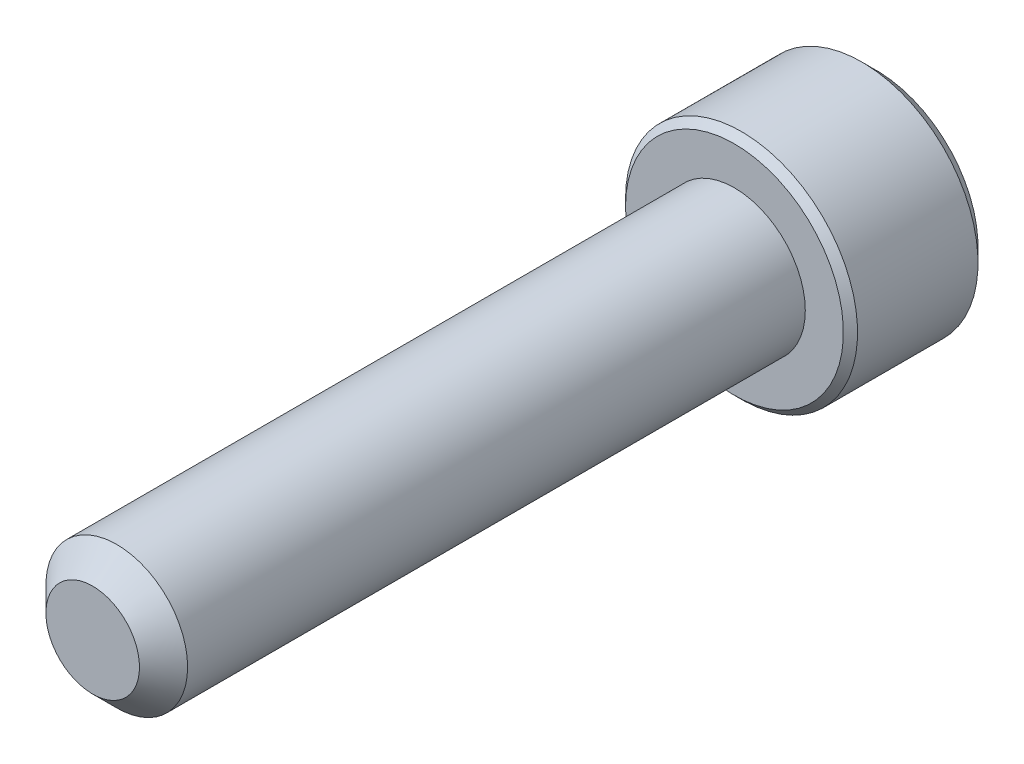
ISO-10303-21;
HEADER;
FILE_DESCRIPTION(('STEP AP214'),'2;1');
FILE_NAME('part.step','',(''),(''),'','','');
FILE_SCHEMA(('AUTOMOTIVE_DESIGN { 1 0 10303 214 1 1 1 1 }'));
ENDSEC;
DATA;
#1=APPLICATION_CONTEXT('core data for automotive mechanical design processes');
#2=APPLICATION_PROTOCOL_DEFINITION('international standard','automotive_design',2000,#1);
#3=PRODUCT_CONTEXT('',#1,'mechanical');
#4=PRODUCT('Part','Part','',(#3));
#5=PRODUCT_RELATED_PRODUCT_CATEGORY('part','',(#4));
#6=PRODUCT_DEFINITION_FORMATION('','',#4);
#7=PRODUCT_DEFINITION_CONTEXT('part definition',#1,'design');
#8=PRODUCT_DEFINITION('design','',#6,#7);
#9=PRODUCT_DEFINITION_SHAPE('','',#8);
#10=(LENGTH_UNIT() NAMED_UNIT(*) SI_UNIT(.MILLI.,.METRE.));
#11=(NAMED_UNIT(*) PLANE_ANGLE_UNIT() SI_UNIT($,.RADIAN.));
#12=(NAMED_UNIT(*) SI_UNIT($,.STERADIAN.) SOLID_ANGLE_UNIT());
#13=UNCERTAINTY_MEASURE_WITH_UNIT(LENGTH_MEASURE(1.E-05),#10,'distance_accuracy_value','');
#14=(GEOMETRIC_REPRESENTATION_CONTEXT(3) GLOBAL_UNCERTAINTY_ASSIGNED_CONTEXT((#13)) GLOBAL_UNIT_ASSIGNED_CONTEXT((#10,
#11,#12)) REPRESENTATION_CONTEXT('',''));
#15=CARTESIAN_POINT('',(0.,0.,0.));
#16=DIRECTION('',(0.,0.,1.));
#17=DIRECTION('',(1.,0.,0.));
#18=AXIS2_PLACEMENT_3D('',#15,#16,#17);
#19=CARTESIAN_POINT('',(0.,0.,-15.875));
#20=DIRECTION('',(0.,0.,1.));
#21=DIRECTION('',(1.,0.,0.));
#22=AXIS2_PLACEMENT_3D('',#19,#20,#21);
#23=CYLINDRICAL_SURFACE('',#22,1.7526);
#24=CARTESIAN_POINT('',(0.,0.,-0.5953125));
#25=DIRECTION('',(0.,0.,1.));
#26=DIRECTION('',(1.,0.,0.));
#27=AXIS2_PLACEMENT_3D('',#24,#25,#26);
#28=CIRCLE('',#27,1.7526);
#29=CARTESIAN_POINT('',(1.7526,0.,-0.5953125));
#30=VERTEX_POINT('',#29);
#31=EDGE_CURVE('E111',#30,#30,#28,.F.);
#32=ORIENTED_EDGE('',*,*,#31,.T.);
#33=EDGE_LOOP('',(#32));
#34=FACE_BOUND('',#33,.T.);
#35=CARTESIAN_POINT('',(0.,0.,-15.875));
#36=DIRECTION('',(0.,0.,-1.));
#37=DIRECTION('',(-1.,0.,0.));
#38=AXIS2_PLACEMENT_3D('',#35,#36,#37);
#39=CIRCLE('',#38,1.7526);
#40=CARTESIAN_POINT('',(-1.7526,0.,-15.875));
#41=VERTEX_POINT('',#40);
#42=EDGE_CURVE('E211',#41,#41,#39,.F.);
#43=ORIENTED_EDGE('',*,*,#42,.T.);
#44=EDGE_LOOP('',(#43));
#45=FACE_BOUND('',#44,.T.);
#46=ADVANCED_FACE('F37',(#34,#45),#23,.T.);
#47=CARTESIAN_POINT('',(0.,0.,0.));
#48=DIRECTION('',(0.,0.,1.));
#49=DIRECTION('',(1.,0.,0.));
#50=AXIS2_PLACEMENT_3D('',#47,#48,#49);
#51=PLANE('',#50);
#52=CARTESIAN_POINT('',(0.,0.,0.));
#53=DIRECTION('',(0.,0.,1.));
#54=DIRECTION('',(1.,0.,0.));
#55=AXIS2_PLACEMENT_3D('',#52,#53,#54);
#56=CIRCLE('',#55,1.1572875);
#57=CARTESIAN_POINT('',(1.1572875,0.,0.));
#58=VERTEX_POINT('',#57);
#59=EDGE_CURVE('E210',#58,#58,#56,.T.);
#60=ORIENTED_EDGE('',*,*,#59,.T.);
#61=EDGE_LOOP('',(#60));
#62=FACE_BOUND('',#61,.T.);
#63=ADVANCED_FACE('F188',(#62),#51,.T.);
#64=CARTESIAN_POINT('',(0.,0.,0.));
#65=DIRECTION('',(0.,0.,-1.));
#66=DIRECTION('',(-1.,0.,0.));
#67=AXIS2_PLACEMENT_3D('',#64,#65,#66);
#68=CONICAL_SURFACE('',#67,1.1572875,0.785398163397445);
#69=ORIENTED_EDGE('',*,*,#31,.F.);
#70=EDGE_LOOP('',(#69));
#71=FACE_BOUND('',#70,.T.);
#72=ORIENTED_EDGE('',*,*,#59,.F.);
#73=EDGE_LOOP('',(#72));
#74=FACE_BOUND('',#73,.T.);
#75=ADVANCED_FACE('F194',(#71,#74),#68,.T.);
#76=CARTESIAN_POINT('',(0.,0.,-19.3802));
#77=DIRECTION('',(0.,0.,1.));
#78=DIRECTION('',(1.,0.,0.));
#79=AXIS2_PLACEMENT_3D('',#76,#77,#78);
#80=CYLINDRICAL_SURFACE('',#79,2.8702);
#81=CARTESIAN_POINT('',(0.,0.,-16.05026));
#82=DIRECTION('',(0.,0.,-1.));
#83=DIRECTION('',(-1.,0.,0.));
#84=AXIS2_PLACEMENT_3D('',#81,#82,#83);
#85=CIRCLE('',#84,2.8702);
#86=CARTESIAN_POINT('',(-2.8702,0.,-16.05026));
#87=VERTEX_POINT('',#86);
#88=EDGE_CURVE('E45',#87,#87,#85,.T.);
#89=ORIENTED_EDGE('',*,*,#88,.T.);
#90=EDGE_LOOP('',(#89));
#91=FACE_BOUND('',#90,.T.);
#92=CARTESIAN_POINT('',(0.,0.,-19.02968));
#93=DIRECTION('',(0.,0.,-1.));
#94=DIRECTION('',(-1.,0.,0.));
#95=AXIS2_PLACEMENT_3D('',#92,#93,#94);
#96=CIRCLE('',#95,2.8702);
#97=CARTESIAN_POINT('',(-2.8702,0.,-19.02968));
#98=VERTEX_POINT('',#97);
#99=EDGE_CURVE('E171',#98,#98,#96,.F.);
#100=ORIENTED_EDGE('',*,*,#99,.T.);
#101=EDGE_LOOP('',(#100));
#102=FACE_BOUND('',#101,.T.);
#103=ADVANCED_FACE('F176',(#91,#102),#80,.T.);
#104=CARTESIAN_POINT('',(0.,0.,-19.3802));
#105=DIRECTION('',(0.,0.,-1.));
#106=DIRECTION('',(-1.,0.,0.));
#107=AXIS2_PLACEMENT_3D('',#104,#105,#106);
#108=PLANE('',#107);
#109=CARTESIAN_POINT('',(0.,0.,-19.3802));
#110=DIRECTION('',(0.,0.,-1.));
#111=DIRECTION('',(-1.,0.,0.));
#112=AXIS2_PLACEMENT_3D('',#109,#110,#111);
#113=CIRCLE('',#112,2.51968);
#114=CARTESIAN_POINT('',(-2.51968,0.,-19.3802));
#115=VERTEX_POINT('',#114);
#116=EDGE_CURVE('E110',#115,#115,#113,.T.);
#117=ORIENTED_EDGE('',*,*,#116,.T.);
#118=EDGE_LOOP('',(#117));
#119=FACE_BOUND('',#118,.T.);
#120=CARTESIAN_POINT('',(0.,0.,-19.3802));
#121=DIRECTION('',(0.,0.,-1.));
#122=DIRECTION('',(-1.,0.,0.));
#123=AXIS2_PLACEMENT_3D('',#120,#121,#122);
#124=CIRCLE('',#123,1.60395121659243);
#125=CARTESIAN_POINT('',(-1.3890625,0.801975608296217,-19.3802));
#126=VERTEX_POINT('',#125);
#127=CARTESIAN_POINT('',(0.,1.60395121659243,-19.3802));
#128=VERTEX_POINT('',#127);
#129=EDGE_CURVE('E91',#126,#128,#124,.T.);
#130=ORIENTED_EDGE('',*,*,#129,.F.);
#131=CARTESIAN_POINT('',(-1.3890625,-0.801975608296215,-19.3802));
#132=VERTEX_POINT('',#131);
#133=EDGE_CURVE('E51',#132,#126,#124,.T.);
#134=ORIENTED_EDGE('',*,*,#133,.F.);
#135=CARTESIAN_POINT('',(0.,-1.60395121659243,-19.3802));
#136=VERTEX_POINT('',#135);
#137=EDGE_CURVE('E267',#136,#132,#124,.T.);
#138=ORIENTED_EDGE('',*,*,#137,.F.);
#139=CARTESIAN_POINT('',(1.3890625,-0.801975608296215,-19.3802));
#140=VERTEX_POINT('',#139);
#141=EDGE_CURVE('E58',#140,#136,#124,.T.);
#142=ORIENTED_EDGE('',*,*,#141,.F.);
#143=CARTESIAN_POINT('',(1.3890625,0.801975608296215,-19.3802));
#144=VERTEX_POINT('',#143);
#145=EDGE_CURVE('E132',#144,#140,#124,.T.);
#146=ORIENTED_EDGE('',*,*,#145,.F.);
#147=EDGE_CURVE('E100',#128,#144,#124,.T.);
#148=ORIENTED_EDGE('',*,*,#147,.F.);
#149=EDGE_LOOP('',(#130,#134,#138,#142,#146,#148));
#150=FACE_BOUND('',#149,.T.);
#151=ADVANCED_FACE('F131',(#119,#150),#108,.T.);
#152=CARTESIAN_POINT('',(0.,0.,-15.875));
#153=DIRECTION('',(0.,0.,-1.));
#154=DIRECTION('',(-1.,0.,0.));
#155=AXIS2_PLACEMENT_3D('',#152,#153,#154);
#156=PLANE('',#155);
#157=CARTESIAN_POINT('',(0.,0.,-15.875));
#158=DIRECTION('',(0.,0.,-1.));
#159=DIRECTION('',(-1.,0.,0.));
#160=AXIS2_PLACEMENT_3D('',#157,#158,#159);
#161=CIRCLE('',#160,2.69494);
#162=CARTESIAN_POINT('',(-2.69494,0.,-15.875));
#163=VERTEX_POINT('',#162);
#164=EDGE_CURVE('E12',#163,#163,#161,.F.);
#165=ORIENTED_EDGE('',*,*,#164,.T.);
#166=EDGE_LOOP('',(#165));
#167=FACE_BOUND('',#166,.T.);
#168=ORIENTED_EDGE('',*,*,#42,.F.);
#169=EDGE_LOOP('',(#168));
#170=FACE_BOUND('',#169,.T.);
#171=ADVANCED_FACE('F279',(#167,#170),#156,.F.);
#172=CARTESIAN_POINT('',(0.,0.,-19.3802));
#173=DIRECTION('',(0.,0.,-1.));
#174=DIRECTION('',(-1.,0.,0.));
#175=AXIS2_PLACEMENT_3D('',#172,#173,#174);
#176=CONICAL_SURFACE('',#175,1.60395121659243,0.78539816339745);
#177=ORIENTED_EDGE('',*,*,#147,.T.);
#178=CARTESIAN_POINT('',(-0.000200000000000534,1.60406668664627,-19.3803154825221));
#179=CARTESIAN_POINT('',(0.047554814899585,1.57649543140889,-19.352764786881));
#180=CARTESIAN_POINT('',(0.0961082129767664,1.54846311395896,-19.3268319141145));
#181=CARTESIAN_POINT('',(0.195114281423183,1.49130193369001,-19.2793489608708));
#182=CARTESIAN_POINT('',(0.245576372730139,1.46216763169007,-19.2578253080794));
#183=CARTESIAN_POINT('',(0.347330835284907,1.40341966534283,-19.2209546019866));
#184=CARTESIAN_POINT('',(0.398597278416373,1.37382097060048,-19.2055148513149));
#185=CARTESIAN_POINT('',(0.502259069123936,1.31397180783079,-19.1817264581829));
#186=CARTESIAN_POINT('',(0.554651247789431,1.28372316937484,-19.1733600517165));
#187=CARTESIAN_POINT('',(0.644944084544834,1.23159257576821,-19.1658113663708));
#188=CARTESIAN_POINT('',(0.6827280342556,1.20977800223165,-19.1646936971037));
#189=CARTESIAN_POINT('',(0.758229287800437,1.16618733317339,-19.1665750513552));
#190=CARTESIAN_POINT('',(0.795946575086517,1.14441124720567,-19.1695749834252));
#191=CARTESIAN_POINT('',(0.87101801890652,1.10106872890774,-19.1795189567457));
#192=CARTESIAN_POINT('',(0.908371804329553,1.0795025108385,-19.1864666704902));
#193=CARTESIAN_POINT('',(0.982452435596039,1.03673203843505,-19.2039288810594));
#194=CARTESIAN_POINT('',(1.01917900521513,1.01552794357906,-19.2144449088769));
#195=CARTESIAN_POINT('',(1.11325413716703,0.961213640822578,-19.2456664203823));
#196=CARTESIAN_POINT('',(1.17001916310317,0.928440337817795,-19.2687263608604));
#197=CARTESIAN_POINT('',(1.25348479270274,0.880251434100403,-19.3076547118294));
#198=CARTESIAN_POINT('',(1.28098915116073,0.86437178534079,-19.3213318145832));
#199=CARTESIAN_POINT('',(1.33549195495674,0.832904576897577,-19.3499348081189));
#200=CARTESIAN_POINT('',(1.36249063449213,0.817316882000056,-19.3648601023926));
#201=CARTESIAN_POINT('',(1.3892625,0.801860138242377,-19.3803154825221));
#202=B_SPLINE_CURVE_WITH_KNOTS('',3,(#178,#179,#180,#181,#182,#183,#184,#185,#186,#187,#188,
#189,#190,#191,#192,#193,#194,#195,#196,#197,#198,#199,#200,#201),.UNSPECIFIED.,.F.,.F.,(4,2,2,
2,2,2,2,2,2,2,2,4),(0.,0.185054161583331,0.371186974731964,0.554362620151552,0.737076859824673,
0.867821902366107,0.998595798526817,1.12949154907136,1.26044353188444,1.46846066168042,
1.57218026599104,1.67585058309997),.UNSPECIFIED.);
#203=EDGE_CURVE('E105',#128,#144,#202,.T.);
#204=ORIENTED_EDGE('',*,*,#203,.F.);
#205=EDGE_LOOP('',(#177,#204));
#206=FACE_BOUND('',#205,.T.);
#207=ADVANCED_FACE('F106',(#206),#176,.F.);
#208=ORIENTED_EDGE('',*,*,#145,.T.);
#209=CARTESIAN_POINT('',(1.3890625,-1.61940394480745,-19.9097819482223));
#210=CARTESIAN_POINT('',(1.3890625,-1.58006115349146,-19.8799243271923));
#211=CARTESIAN_POINT('',(1.3890625,-1.54050132955006,-19.8503535181349));
#212=CARTESIAN_POINT('',(1.3890625,-1.46085876241779,-19.7919045446385));
#213=CARTESIAN_POINT('',(1.3890625,-1.42077589246553,-19.7630265531062));
#214=CARTESIAN_POINT('',(1.3890625,-1.29902274997118,-19.6771982113368));
#215=CARTESIAN_POINT('',(1.3890625,-1.21644571524143,-19.6215129842253));
#216=CARTESIAN_POINT('',(1.3890625,-1.04315507977619,-19.5120119606919));
#217=CARTESIAN_POINT('',(1.3890625,-0.952248476193909,-19.458498197639));
#218=CARTESIAN_POINT('',(1.3890625,-0.765869525131634,-19.3604818620338));
#219=CARTESIAN_POINT('',(1.3890625,-0.670413981853178,-19.3159488871386));
#220=CARTESIAN_POINT('',(1.3890625,-0.527324185824119,-19.2614610332753));
#221=CARTESIAN_POINT('',(1.3890625,-0.481850777039666,-19.2458565157759));
#222=CARTESIAN_POINT('',(1.3890625,-0.389788715477723,-19.2182958930188));
#223=CARTESIAN_POINT('',(1.3890625,-0.343199987774419,-19.2063400336196));
#224=CARTESIAN_POINT('',(1.3890625,-0.249973786412085,-19.1869026508989));
#225=CARTESIAN_POINT('',(1.3890625,-0.20335281289058,-19.1793432373454));
#226=CARTESIAN_POINT('',(1.3890625,-0.109590268814354,-19.1688495716361));
#227=CARTESIAN_POINT('',(1.3890625,-0.0624487940539219,-19.1659144822393));
#228=CARTESIAN_POINT('',(1.3890625,0.0300876528594539,-19.1648959870312));
#229=CARTESIAN_POINT('',(1.3890625,0.0754806899085093,-19.1666318778689));
#230=CARTESIAN_POINT('',(1.3890625,0.165887420036847,-19.1744562074487));
#231=CARTESIAN_POINT('',(1.3890625,0.210901076451833,-19.1805450621007));
#232=CARTESIAN_POINT('',(1.3890625,0.300985584808156,-19.1968429071109));
#233=CARTESIAN_POINT('',(1.3890625,0.346043426477339,-19.2071227134166));
#234=CARTESIAN_POINT('',(1.3890625,0.435171985795336,-19.2312501165965));
#235=CARTESIAN_POINT('',(1.3890625,0.479242778772565,-19.2450974401937));
#236=CARTESIAN_POINT('',(1.3890625,0.617097855137391,-19.2936456952925));
#237=CARTESIAN_POINT('',(1.3890625,0.708943143387239,-19.3338382623019));
#238=CARTESIAN_POINT('',(1.3890625,0.888326863327377,-19.4232263268257));
#239=CARTESIAN_POINT('',(1.3890625,0.975848443102531,-19.4724539890072));
#240=CARTESIAN_POINT('',(1.3890625,1.14312734298093,-19.574041791674));
#241=CARTESIAN_POINT('',(1.3890625,1.22305448923178,-19.6261257684336));
#242=CARTESIAN_POINT('',(1.3890625,1.3408107215704,-19.7066537579098));
#243=CARTESIAN_POINT('',(1.3890625,1.37955507371222,-19.7337826125004));
#244=CARTESIAN_POINT('',(1.3890625,1.4565136416918,-19.78876083201));
#245=CARTESIAN_POINT('',(1.3890625,1.49472800051003,-19.8166099965591));
#246=CARTESIAN_POINT('',(1.3890625,1.53272159252287,-19.844757934727));
#247=B_SPLINE_CURVE_WITH_KNOTS('',3,(#209,#210,#211,#212,#213,#214,#215,#216,#217,#218,#219,
#220,#221,#222,#223,#224,#225,#226,#227,#228,#229,#230,#231,#232,#233,#234,#235,#236,#237,#238,
#239,#240,#241,#242,#243,#244,#245,#246),.UNSPECIFIED.,.F.,.F.,(4,2,2,2,2,2,2,2,2,2,2,2,2,2,2,2,
2,2,4),(0.,0.148165097735295,0.296366796320978,0.595030749860533,0.911241326915103,
1.22636278192646,1.37047020890679,1.51458734417271,1.65606664391464,1.79752032566969,
1.93358111293096,2.06965490204564,2.20813012759239,2.34659474888992,2.64647835597473,
2.94745101021194,3.23350725563863,3.37539574691568,3.51724518455276),.UNSPECIFIED.);
#248=EDGE_CURVE('E99',#144,#140,#247,.F.);
#249=ORIENTED_EDGE('',*,*,#248,.F.);
#250=EDGE_LOOP('',(#208,#249));
#251=FACE_BOUND('',#250,.T.);
#252=ADVANCED_FACE('F273',(#251),#176,.F.);
#253=ORIENTED_EDGE('',*,*,#141,.T.);
#254=CARTESIAN_POINT('',(1.3892625,-0.801860138242376,-19.3803154825221));
#255=CARTESIAN_POINT('',(1.34150768510041,-0.829431393479753,-19.352764786881));
#256=CARTESIAN_POINT('',(1.29295428702323,-0.857463710929685,-19.3268319141145));
#257=CARTESIAN_POINT('',(1.19394821857682,-0.91462489119863,-19.2793489608708));
#258=CARTESIAN_POINT('',(1.14348612726986,-0.943759193198572,-19.2578253080794));
#259=CARTESIAN_POINT('',(1.04173166471509,-1.00250715954581,-19.2209546019866));
#260=CARTESIAN_POINT('',(0.990465221583625,-1.03210585428816,-19.2055148513149));
#261=CARTESIAN_POINT('',(0.886803430876063,-1.09195501705785,-19.1817264581829));
#262=CARTESIAN_POINT('',(0.834411252210569,-1.1222036555138,-19.1733600517165));
#263=CARTESIAN_POINT('',(0.744118415455167,-1.17433424912043,-19.1658113663708));
#264=CARTESIAN_POINT('',(0.706334465744401,-1.19614882265699,-19.1646936971037));
#265=CARTESIAN_POINT('',(0.630833212199565,-1.23973949171525,-19.1665750513552));
#266=CARTESIAN_POINT('',(0.593115924913484,-1.26151557768297,-19.1695749834252));
#267=CARTESIAN_POINT('',(0.518044481093482,-1.30485809598091,-19.1795189567457));
#268=CARTESIAN_POINT('',(0.480690695670449,-1.32642431405015,-19.1864666704902));
#269=CARTESIAN_POINT('',(0.406610064403962,-1.36919478645359,-19.2039288810594));
#270=CARTESIAN_POINT('',(0.369883494784874,-1.39039888130958,-19.2144449088769));
#271=CARTESIAN_POINT('',(0.275808362832968,-1.44471318406606,-19.2456664203823));
#272=CARTESIAN_POINT('',(0.219043336896833,-1.47748648707085,-19.2687263608604));
#273=CARTESIAN_POINT('',(0.135577707297264,-1.52567539078824,-19.3076547118294));
#274=CARTESIAN_POINT('',(0.108073348839269,-1.54155503954785,-19.3213318145832));
#275=CARTESIAN_POINT('',(0.0535705450432624,-1.57302224799107,-19.3499348081189));
#276=CARTESIAN_POINT('',(0.0265718655078741,-1.58860994288859,-19.3648601023926));
#277=CARTESIAN_POINT('',(-0.000199999999998959,-1.60406668664627,-19.3803154825221));
#278=B_SPLINE_CURVE_WITH_KNOTS('',3,(#254,#255,#256,#257,#258,#259,#260,#261,#262,#263,#264,
#265,#266,#267,#268,#269,#270,#271,#272,#273,#274,#275,#276,#277),.UNSPECIFIED.,.F.,.F.,(4,2,2,
2,2,2,2,2,2,2,2,4),(0.,0.185054161583331,0.371186974731965,0.554362620151551,0.737076859824669,
0.867821902366103,0.998595798526814,1.12949154907136,1.26044353188443,1.46846066168042,
1.57218026599103,1.67585058309997),.UNSPECIFIED.);
#279=EDGE_CURVE('E141',#140,#136,#278,.T.);
#280=ORIENTED_EDGE('',*,*,#279,.F.);
#281=EDGE_LOOP('',(#253,#280));
#282=FACE_BOUND('',#281,.T.);
#283=ADVANCED_FACE('F270',(#282),#176,.F.);
#284=ORIENTED_EDGE('',*,*,#137,.T.);
#285=CARTESIAN_POINT('',(0.000199999999999772,-1.60406668664627,-19.3803154825221));
#286=CARTESIAN_POINT('',(-0.0475548148995866,-1.57649543140889,-19.352764786881));
#287=CARTESIAN_POINT('',(-0.0961082129767685,-1.54846311395896,-19.3268319141145));
#288=CARTESIAN_POINT('',(-0.195114281423185,-1.49130193369001,-19.2793489608708));
#289=CARTESIAN_POINT('',(-0.245576372730141,-1.46216763169007,-19.2578253080794));
#290=CARTESIAN_POINT('',(-0.347330835284909,-1.40341966534283,-19.2209546019866));
#291=CARTESIAN_POINT('',(-0.398597278416374,-1.37382097060048,-19.2055148513149));
#292=CARTESIAN_POINT('',(-0.502259069123936,-1.31397180783079,-19.1817264581829));
#293=CARTESIAN_POINT('',(-0.55465124778943,-1.28372316937484,-19.1733600517165));
#294=CARTESIAN_POINT('',(-0.644944084544832,-1.23159257576821,-19.1658113663708));
#295=CARTESIAN_POINT('',(-0.682728034255598,-1.20977800223165,-19.1646936971037));
#296=CARTESIAN_POINT('',(-0.758229287800435,-1.16618733317339,-19.1665750513552));
#297=CARTESIAN_POINT('',(-0.795946575086516,-1.14441124720567,-19.1695749834252));
#298=CARTESIAN_POINT('',(-0.871018018906518,-1.10106872890774,-19.1795189567457));
#299=CARTESIAN_POINT('',(-0.908371804329551,-1.0795025108385,-19.1864666704902));
#300=CARTESIAN_POINT('',(-0.982452435596038,-1.03673203843505,-19.2039288810594));
#301=CARTESIAN_POINT('',(-1.01917900521513,-1.01552794357906,-19.2144449088769));
#302=CARTESIAN_POINT('',(-1.11325413716703,-0.961213640822578,-19.2456664203823));
#303=CARTESIAN_POINT('',(-1.17001916310317,-0.928440337817794,-19.2687263608604));
#304=CARTESIAN_POINT('',(-1.25348479270273,-0.880251434100402,-19.3076547118294));
#305=CARTESIAN_POINT('',(-1.28098915116073,-0.864371785340791,-19.3213318145832));
#306=CARTESIAN_POINT('',(-1.33549195495674,-0.832904576897577,-19.3499348081189));
#307=CARTESIAN_POINT('',(-1.36249063449212,-0.817316882000056,-19.3648601023926));
#308=CARTESIAN_POINT('',(-1.3892625,-0.801860138242377,-19.3803154825221));
#309=B_SPLINE_CURVE_WITH_KNOTS('',3,(#285,#286,#287,#288,#289,#290,#291,#292,#293,#294,#295,
#296,#297,#298,#299,#300,#301,#302,#303,#304,#305,#306,#307,#308),.UNSPECIFIED.,.F.,.F.,(4,2,2,
2,2,2,2,2,2,2,2,4),(0.,0.185054161583333,0.371186974731965,0.554362620151551,0.73707685982467,
0.867821902366103,0.998595798526814,1.12949154907136,1.26044353188443,1.46846066168042,
1.57218026599103,1.67585058309997),.UNSPECIFIED.);
#310=EDGE_CURVE('E245',#136,#132,#309,.T.);
#311=ORIENTED_EDGE('',*,*,#310,.F.);
#312=EDGE_LOOP('',(#284,#311));
#313=FACE_BOUND('',#312,.T.);
#314=ADVANCED_FACE('F269',(#313),#176,.F.);
#315=ORIENTED_EDGE('',*,*,#133,.T.);
#316=CARTESIAN_POINT('',(-1.3890625,-1.61940394489368,-19.9097819482877));
#317=CARTESIAN_POINT('',(-1.3890625,-1.58006115357525,-19.8799243272552));
#318=CARTESIAN_POINT('',(-1.3890625,-1.54050132963141,-19.8503535181953));
#319=CARTESIAN_POINT('',(-1.3890625,-1.46085876249422,-19.7919045446939));
#320=CARTESIAN_POINT('',(-1.3890625,-1.42077589253949,-19.7630265531591));
#321=CARTESIAN_POINT('',(-1.3890625,-1.29902275003757,-19.6771982113821));
#322=CARTESIAN_POINT('',(-1.3890625,-1.21644571530268,-19.6215129842656));
#323=CARTESIAN_POINT('',(-1.3890625,-1.04315507982623,-19.5120119607219));
#324=CARTESIAN_POINT('',(-1.3890625,-0.95224847623784,-19.4584981976636));
#325=CARTESIAN_POINT('',(-1.3890625,-0.76586952516284,-19.3604818620486));
#326=CARTESIAN_POINT('',(-1.3890625,-0.670413981877766,-19.315948887149));
#327=CARTESIAN_POINT('',(-1.3890625,-0.527324185843738,-19.2614610332824));
#328=CARTESIAN_POINT('',(-1.3890625,-0.481850777061386,-19.2458565157831));
#329=CARTESIAN_POINT('',(-1.3890625,-0.389788715503717,-19.2182958930258));
#330=CARTESIAN_POINT('',(-1.3890625,-0.343199987802587,-19.2063400336264));
#331=CARTESIAN_POINT('',(-1.3890625,-0.249973786444529,-19.1869026509047));
#332=CARTESIAN_POINT('',(-1.3890625,-0.203352812925126,-19.1793432373505));
#333=CARTESIAN_POINT('',(-1.3890625,-0.109590268853037,-19.1688495716392));
#334=CARTESIAN_POINT('',(-1.3890625,-0.0624487940946412,-19.1659144822412));
#335=CARTESIAN_POINT('',(-1.3890625,0.0300876528150607,-19.1648959870303));
#336=CARTESIAN_POINT('',(-1.3890625,0.0754806898624728,-19.1666318778665));
#337=CARTESIAN_POINT('',(-1.3890625,0.165887419987694,-19.1744562074429));
#338=CARTESIAN_POINT('',(-1.3890625,0.210901076401206,-19.1805450620931));
#339=CARTESIAN_POINT('',(-1.3890625,0.300985584754618,-19.1968429070996));
#340=CARTESIAN_POINT('',(-1.3890625,0.346043426422371,-19.2071227134034));
#341=CARTESIAN_POINT('',(-1.3890625,0.435171985737648,-19.2312501165793));
#342=CARTESIAN_POINT('',(-1.3890625,0.479242778713588,-19.2450974401744));
#343=CARTESIAN_POINT('',(-1.3890625,0.617097855065661,-19.2936456952639));
#344=CARTESIAN_POINT('',(-1.3890625,0.708943143304684,-19.3338382622647));
#345=CARTESIAN_POINT('',(-1.3890625,0.888326863224004,-19.4232263267703));
#346=CARTESIAN_POINT('',(-1.3890625,0.97584844298917,-19.4724539889421));
#347=CARTESIAN_POINT('',(-1.3890625,1.14312734284962,-19.5740417915907));
#348=CARTESIAN_POINT('',(-1.3890625,1.22305448909243,-19.6261257683416));
#349=CARTESIAN_POINT('',(-1.3890625,1.34081072141919,-19.7066537578048));
#350=CARTESIAN_POINT('',(-1.3890625,1.37955507355711,-19.7337826123911));
#351=CARTESIAN_POINT('',(-1.3890625,1.45651364152892,-19.7887608318921));
#352=CARTESIAN_POINT('',(-1.3890625,1.49472800034328,-19.8166099964369));
#353=CARTESIAN_POINT('',(-1.3890625,1.53272159235225,-19.8447579346005));
#354=B_SPLINE_CURVE_WITH_KNOTS('',3,(#316,#317,#318,#319,#320,#321,#322,#323,#324,#325,#326,
#327,#328,#329,#330,#331,#332,#333,#334,#335,#336,#337,#338,#339,#340,#341,#342,#343,#344,#345,
#346,#347,#348,#349,#350,#351,#352,#353),.UNSPECIFIED.,.F.,.F.,(4,2,2,2,2,2,2,2,2,2,2,2,2,2,2,2,
2,2,4),(0.,0.148165097745703,0.296366796341797,0.595030749902564,0.91124132698094,
1.22636278201588,1.37047020899011,1.51458734424994,1.65606664398604,1.79752032573526,
1.93358111299144,2.06965490210104,2.20813012764229,2.34659474893434,2.6464783559792,
2.9474510101762,3.23350725556849,3.37539574682858,3.5172451844487),.UNSPECIFIED.);
#355=EDGE_CURVE('E121',#132,#126,#354,.T.);
#356=ORIENTED_EDGE('',*,*,#355,.F.);
#357=EDGE_LOOP('',(#315,#356));
#358=FACE_BOUND('',#357,.T.);
#359=ADVANCED_FACE('F286',(#358),#176,.F.);
#360=ORIENTED_EDGE('',*,*,#129,.T.);
#361=CARTESIAN_POINT('',(-1.3892625,0.801860138242378,-19.3803154825221));
#362=CARTESIAN_POINT('',(-1.34150768510041,0.829431393479755,-19.352764786881));
#363=CARTESIAN_POINT('',(-1.29295428702323,0.857463710929687,-19.3268319141145));
#364=CARTESIAN_POINT('',(-1.19394821857681,0.914624891198632,-19.2793489608708));
#365=CARTESIAN_POINT('',(-1.14348612726986,0.943759193198575,-19.2578253080794));
#366=CARTESIAN_POINT('',(-1.04173166471509,1.00250715954582,-19.2209546019866));
#367=CARTESIAN_POINT('',(-0.990465221583623,1.03210585428816,-19.2055148513149));
#368=CARTESIAN_POINT('',(-0.886803430876061,1.09195501705785,-19.1817264581829));
#369=CARTESIAN_POINT('',(-0.834411252210566,1.12220365551381,-19.1733600517165));
#370=CARTESIAN_POINT('',(-0.744118415455163,1.17433424912043,-19.1658113663708));
#371=CARTESIAN_POINT('',(-0.706334465744397,1.19614882265699,-19.1646936971037));
#372=CARTESIAN_POINT('',(-0.630833212199561,1.23973949171526,-19.1665750513552));
#373=CARTESIAN_POINT('',(-0.59311592491348,1.26151557768298,-19.1695749834252));
#374=CARTESIAN_POINT('',(-0.518044481093478,1.30485809598091,-19.1795189567457));
#375=CARTESIAN_POINT('',(-0.480690695670445,1.32642431405015,-19.1864666704902));
#376=CARTESIAN_POINT('',(-0.406610064403958,1.36919478645359,-19.2039288810594));
#377=CARTESIAN_POINT('',(-0.369883494784871,1.39039888130958,-19.2144449088769));
#378=CARTESIAN_POINT('',(-0.275808362832965,1.44471318406607,-19.2456664203823));
#379=CARTESIAN_POINT('',(-0.219043336896832,1.47748648707085,-19.2687263608604));
#380=CARTESIAN_POINT('',(-0.135577707297265,1.52567539078824,-19.3076547118294));
#381=CARTESIAN_POINT('',(-0.10807334883927,1.54155503954785,-19.3213318145832));
#382=CARTESIAN_POINT('',(-0.0535705450432632,1.57302224799107,-19.3499348081189));
#383=CARTESIAN_POINT('',(-0.0265718655078742,1.58860994288859,-19.3648601023926));
#384=CARTESIAN_POINT('',(0.000199999999999513,1.60406668664627,-19.3803154825221));
#385=B_SPLINE_CURVE_WITH_KNOTS('',3,(#361,#362,#363,#364,#365,#366,#367,#368,#369,#370,#371,
#372,#373,#374,#375,#376,#377,#378,#379,#380,#381,#382,#383,#384),.UNSPECIFIED.,.F.,.F.,(4,2,2,
2,2,2,2,2,2,2,2,4),(0.,0.185054161583333,0.371186974731965,0.554362620151551,0.737076859824671,
0.867821902366105,0.998595798526816,1.12949154907136,1.26044353188444,1.46846066168041,
1.57218026599103,1.67585058309996),.UNSPECIFIED.);
#386=EDGE_CURVE('E95',#126,#128,#385,.T.);
#387=ORIENTED_EDGE('',*,*,#386,.F.);
#388=EDGE_LOOP('',(#360,#387));
#389=FACE_BOUND('',#388,.T.);
#390=ADVANCED_FACE('F93',(#389),#176,.F.);
#391=CARTESIAN_POINT('',(1.3890625,2.40592682488864,-17.29660625));
#392=DIRECTION('',(0.,0.,-1.));
#393=DIRECTION('',(-1.,0.,0.));
#394=AXIS2_PLACEMENT_3D('',#391,#392,#393);
#395=PLANE('',#394);
#396=DIRECTION('',(0.866025403784439,0.5,0.));
#397=VECTOR('',#396,1.);
#398=CARTESIAN_POINT('',(-1.3890625,0.801975608296216,-17.29660625));
#399=LINE('',#398,#397);
#400=CARTESIAN_POINT('',(-1.3890625,0.801975608296216,-17.29660625));
#401=VERTEX_POINT('',#400);
#402=CARTESIAN_POINT('',(0.,1.60395121659243,-17.29660625));
#403=VERTEX_POINT('',#402);
#404=EDGE_CURVE('E120',#401,#403,#399,.T.);
#405=ORIENTED_EDGE('',*,*,#404,.T.);
#406=DIRECTION('',(0.866025403784439,-0.5,0.));
#407=VECTOR('',#406,1.);
#408=CARTESIAN_POINT('',(0.,1.60395121659243,-17.29660625));
#409=LINE('',#408,#407);
#410=CARTESIAN_POINT('',(1.3890625,0.801975608296215,-17.29660625));
#411=VERTEX_POINT('',#410);
#412=EDGE_CURVE('E125',#403,#411,#409,.T.);
#413=ORIENTED_EDGE('',*,*,#412,.T.);
#414=DIRECTION('',(0.,-1.,0.));
#415=VECTOR('',#414,1.);
#416=CARTESIAN_POINT('',(1.3890625,0.801975608296215,-17.29660625));
#417=LINE('',#416,#415);
#418=CARTESIAN_POINT('',(1.3890625,-0.801975608296214,-17.29660625));
#419=VERTEX_POINT('',#418);
#420=EDGE_CURVE('E233',#411,#419,#417,.T.);
#421=ORIENTED_EDGE('',*,*,#420,.T.);
#422=DIRECTION('',(-0.866025403784439,-0.5,0.));
#423=VECTOR('',#422,1.);
#424=CARTESIAN_POINT('',(1.3890625,-0.801975608296214,-17.29660625));
#425=LINE('',#424,#423);
#426=CARTESIAN_POINT('',(0.,-1.60395121659243,-17.29660625));
#427=VERTEX_POINT('',#426);
#428=EDGE_CURVE('E230',#419,#427,#425,.T.);
#429=ORIENTED_EDGE('',*,*,#428,.T.);
#430=DIRECTION('',(-0.866025403784439,0.5,0.));
#431=VECTOR('',#430,1.);
#432=CARTESIAN_POINT('',(0.,-1.60395121659243,-17.29660625));
#433=LINE('',#432,#431);
#434=CARTESIAN_POINT('',(-1.3890625,-0.801975608296215,-17.29660625));
#435=VERTEX_POINT('',#434);
#436=EDGE_CURVE('E227',#427,#435,#433,.T.);
#437=ORIENTED_EDGE('',*,*,#436,.T.);
#438=DIRECTION('',(0.,1.,0.));
#439=VECTOR('',#438,1.);
#440=CARTESIAN_POINT('',(-1.3890625,-0.801975608296215,-17.29660625));
#441=LINE('',#440,#439);
#442=EDGE_CURVE('E128',#435,#401,#441,.T.);
#443=ORIENTED_EDGE('',*,*,#442,.T.);
#444=EDGE_LOOP('',(#405,#413,#421,#429,#437,#443));
#445=FACE_BOUND('',#444,.T.);
#446=ADVANCED_FACE('F160',(#445),#395,.T.);
#447=CARTESIAN_POINT('',(0.,1.60395121659243,-17.29660625));
#448=DIRECTION('',(0.5,0.866025403784439,0.));
#449=DIRECTION('',(-0.866025403784439,0.5,0.));
#450=AXIS2_PLACEMENT_3D('',#447,#448,#449);
#451=PLANE('',#450);
#452=DIRECTION('',(0.,0.,-1.));
#453=VECTOR('',#452,1.);
#454=CARTESIAN_POINT('',(0.,1.60395121659243,-17.29660625));
#455=LINE('',#454,#453);
#456=EDGE_CURVE('E117',#403,#128,#455,.T.);
#457=ORIENTED_EDGE('',*,*,#456,.T.);
#458=ORIENTED_EDGE('',*,*,#203,.T.);
#459=DIRECTION('',(0.,0.,-1.));
#460=VECTOR('',#459,1.);
#461=CARTESIAN_POINT('',(1.3890625,0.801975608296215,-17.29660625));
#462=LINE('',#461,#460);
#463=EDGE_CURVE('E127',#411,#144,#462,.T.);
#464=ORIENTED_EDGE('',*,*,#463,.F.);
#465=ORIENTED_EDGE('',*,*,#412,.F.);
#466=EDGE_LOOP('',(#457,#458,#464,#465));
#467=FACE_BOUND('',#466,.T.);
#468=ADVANCED_FACE('F123',(#467),#451,.F.);
#469=CARTESIAN_POINT('',(1.3890625,0.801975608296215,-17.29660625));
#470=DIRECTION('',(1.,0.,0.));
#471=DIRECTION('',(0.,1.,0.));
#472=AXIS2_PLACEMENT_3D('',#469,#470,#471);
#473=PLANE('',#472);
#474=ORIENTED_EDGE('',*,*,#463,.T.);
#475=ORIENTED_EDGE('',*,*,#248,.T.);
#476=DIRECTION('',(0.,0.,-1.));
#477=VECTOR('',#476,1.);
#478=CARTESIAN_POINT('',(1.3890625,-0.801975608296214,-17.29660625));
#479=LINE('',#478,#477);
#480=EDGE_CURVE('E216',#419,#140,#479,.T.);
#481=ORIENTED_EDGE('',*,*,#480,.F.);
#482=ORIENTED_EDGE('',*,*,#420,.F.);
#483=EDGE_LOOP('',(#474,#475,#481,#482));
#484=FACE_BOUND('',#483,.T.);
#485=ADVANCED_FACE('F149',(#484),#473,.F.);
#486=CARTESIAN_POINT('',(1.3890625,-0.801975608296214,-17.29660625));
#487=DIRECTION('',(0.5,-0.866025403784439,0.));
#488=DIRECTION('',(0.866025403784439,0.5,0.));
#489=AXIS2_PLACEMENT_3D('',#486,#487,#488);
#490=PLANE('',#489);
#491=ORIENTED_EDGE('',*,*,#480,.T.);
#492=ORIENTED_EDGE('',*,*,#279,.T.);
#493=DIRECTION('',(0.,0.,-1.));
#494=VECTOR('',#493,1.);
#495=CARTESIAN_POINT('',(0.,-1.60395121659243,-17.29660625));
#496=LINE('',#495,#494);
#497=EDGE_CURVE('E219',#427,#136,#496,.T.);
#498=ORIENTED_EDGE('',*,*,#497,.F.);
#499=ORIENTED_EDGE('',*,*,#428,.F.);
#500=EDGE_LOOP('',(#491,#492,#498,#499));
#501=FACE_BOUND('',#500,.T.);
#502=ADVANCED_FACE('F153',(#501),#490,.F.);
#503=CARTESIAN_POINT('',(0.,-1.60395121659243,-17.29660625));
#504=DIRECTION('',(-0.5,-0.866025403784439,0.));
#505=DIRECTION('',(0.866025403784439,-0.5,0.));
#506=AXIS2_PLACEMENT_3D('',#503,#504,#505);
#507=PLANE('',#506);
#508=ORIENTED_EDGE('',*,*,#497,.T.);
#509=ORIENTED_EDGE('',*,*,#310,.T.);
#510=DIRECTION('',(0.,0.,-1.));
#511=VECTOR('',#510,1.);
#512=CARTESIAN_POINT('',(-1.3890625,-0.801975608296215,-17.29660625));
#513=LINE('',#512,#511);
#514=EDGE_CURVE('E222',#435,#132,#513,.T.);
#515=ORIENTED_EDGE('',*,*,#514,.F.);
#516=ORIENTED_EDGE('',*,*,#436,.F.);
#517=EDGE_LOOP('',(#508,#509,#515,#516));
#518=FACE_BOUND('',#517,.T.);
#519=ADVANCED_FACE('F252',(#518),#507,.F.);
#520=CARTESIAN_POINT('',(-1.3890625,-0.801975608296215,-17.29660625));
#521=DIRECTION('',(-1.,0.,0.));
#522=DIRECTION('',(0.,-1.,0.));
#523=AXIS2_PLACEMENT_3D('',#520,#521,#522);
#524=PLANE('',#523);
#525=ORIENTED_EDGE('',*,*,#514,.T.);
#526=ORIENTED_EDGE('',*,*,#355,.T.);
#527=DIRECTION('',(0.,0.,-1.));
#528=VECTOR('',#527,1.);
#529=CARTESIAN_POINT('',(-1.3890625,0.801975608296216,-17.29660625));
#530=LINE('',#529,#528);
#531=EDGE_CURVE('E119',#401,#126,#530,.T.);
#532=ORIENTED_EDGE('',*,*,#531,.F.);
#533=ORIENTED_EDGE('',*,*,#442,.F.);
#534=EDGE_LOOP('',(#525,#526,#532,#533));
#535=FACE_BOUND('',#534,.T.);
#536=ADVANCED_FACE('F249',(#535),#524,.F.);
#537=CARTESIAN_POINT('',(-1.3890625,0.801975608296216,-17.29660625));
#538=DIRECTION('',(-0.5,0.866025403784439,0.));
#539=DIRECTION('',(-0.866025403784439,-0.5,0.));
#540=AXIS2_PLACEMENT_3D('',#537,#538,#539);
#541=PLANE('',#540);
#542=ORIENTED_EDGE('',*,*,#531,.T.);
#543=ORIENTED_EDGE('',*,*,#386,.T.);
#544=ORIENTED_EDGE('',*,*,#456,.F.);
#545=ORIENTED_EDGE('',*,*,#404,.F.);
#546=EDGE_LOOP('',(#542,#543,#544,#545));
#547=FACE_BOUND('',#546,.T.);
#548=ADVANCED_FACE('F115',(#547),#541,.F.);
#549=CARTESIAN_POINT('',(0.,0.,-19.3802));
#550=DIRECTION('',(0.,0.,1.));
#551=DIRECTION('',(1.,0.,0.));
#552=AXIS2_PLACEMENT_3D('',#549,#550,#551);
#553=CONICAL_SURFACE('',#552,2.51968,0.785398163397439);
#554=ORIENTED_EDGE('',*,*,#99,.F.);
#555=EDGE_LOOP('',(#554));
#556=FACE_BOUND('',#555,.T.);
#557=ORIENTED_EDGE('',*,*,#116,.F.);
#558=EDGE_LOOP('',(#557));
#559=FACE_BOUND('',#558,.T.);
#560=ADVANCED_FACE('F180',(#556,#559),#553,.T.);
#561=CARTESIAN_POINT('',(0.,0.,-16.05026));
#562=DIRECTION('',(0.,0.,-1.));
#563=DIRECTION('',(-1.,0.,0.));
#564=AXIS2_PLACEMENT_3D('',#561,#562,#563);
#565=CONICAL_SURFACE('',#564,2.8702,0.785398163397442);
#566=CARTESIAN_POINT('',(-2.69494,0.,-15.875));
#567=CARTESIAN_POINT('',(-2.696765625,0.,-15.876825625));
#568=CARTESIAN_POINT('',(-2.69859125,0.,-15.87865125));
#569=CARTESIAN_POINT('',(-2.7022425,0.,-15.8823025));
#570=CARTESIAN_POINT('',(-2.704068125,0.,-15.884128125));
#571=CARTESIAN_POINT('',(-2.707719375,0.,-15.887779375));
#572=CARTESIAN_POINT('',(-2.709545,0.,-15.889605));
#573=CARTESIAN_POINT('',(-2.71319625,0.,-15.89325625));
#574=CARTESIAN_POINT('',(-2.715021875,0.,-15.895081875));
#575=CARTESIAN_POINT('',(-2.718673125,0.,-15.898733125));
#576=CARTESIAN_POINT('',(-2.72049875,0.,-15.90055875));
#577=CARTESIAN_POINT('',(-2.72415,0.,-15.90421));
#578=CARTESIAN_POINT('',(-2.725975625,0.,-15.906035625));
#579=CARTESIAN_POINT('',(-2.729626875,0.,-15.909686875));
#580=CARTESIAN_POINT('',(-2.7314525,0.,-15.9115125));
#581=CARTESIAN_POINT('',(-2.73510375,0.,-15.91516375));
#582=CARTESIAN_POINT('',(-2.736929375,0.,-15.916989375));
#583=CARTESIAN_POINT('',(-2.740580625,0.,-15.920640625));
#584=CARTESIAN_POINT('',(-2.74240625,0.,-15.92246625));
#585=CARTESIAN_POINT('',(-2.7460575,0.,-15.9261175));
#586=CARTESIAN_POINT('',(-2.747883125,0.,-15.927943125));
#587=CARTESIAN_POINT('',(-2.751534375,0.,-15.931594375));
#588=CARTESIAN_POINT('',(-2.75336,0.,-15.93342));
#589=CARTESIAN_POINT('',(-2.75701125,0.,-15.93707125));
#590=CARTESIAN_POINT('',(-2.758836875,0.,-15.938896875));
#591=CARTESIAN_POINT('',(-2.762488125,0.,-15.942548125));
#592=CARTESIAN_POINT('',(-2.76431375,0.,-15.94437375));
#593=CARTESIAN_POINT('',(-2.767965,0.,-15.948025));
#594=CARTESIAN_POINT('',(-2.769790625,0.,-15.949850625));
#595=CARTESIAN_POINT('',(-2.773441875,0.,-15.953501875));
#596=CARTESIAN_POINT('',(-2.7752675,0.,-15.9553275));
#597=CARTESIAN_POINT('',(-2.77891875,0.,-15.95897875));
#598=CARTESIAN_POINT('',(-2.780744375,0.,-15.960804375));
#599=CARTESIAN_POINT('',(-2.784395625,0.,-15.964455625));
#600=CARTESIAN_POINT('',(-2.78622125,0.,-15.96628125));
#601=CARTESIAN_POINT('',(-2.7898725,0.,-15.9699325));
#602=CARTESIAN_POINT('',(-2.791698125,0.,-15.971758125));
#603=CARTESIAN_POINT('',(-2.795349375,0.,-15.975409375));
#604=CARTESIAN_POINT('',(-2.797175,0.,-15.977235));
#605=CARTESIAN_POINT('',(-2.80082625,0.,-15.98088625));
#606=CARTESIAN_POINT('',(-2.802651875,0.,-15.982711875));
#607=CARTESIAN_POINT('',(-2.806303125,0.,-15.986363125));
#608=CARTESIAN_POINT('',(-2.80812875,0.,-15.98818875));
#609=CARTESIAN_POINT('',(-2.81178,0.,-15.99184));
#610=CARTESIAN_POINT('',(-2.813605625,0.,-15.993665625));
#611=CARTESIAN_POINT('',(-2.817256875,0.,-15.997316875));
#612=CARTESIAN_POINT('',(-2.8190825,0.,-15.9991425));
#613=CARTESIAN_POINT('',(-2.82273375,0.,-16.00279375));
#614=CARTESIAN_POINT('',(-2.824559375,0.,-16.004619375));
#615=CARTESIAN_POINT('',(-2.828210625,0.,-16.008270625));
#616=CARTESIAN_POINT('',(-2.83003625,0.,-16.01009625));
#617=CARTESIAN_POINT('',(-2.8336875,0.,-16.0137475));
#618=CARTESIAN_POINT('',(-2.835513125,0.,-16.015573125));
#619=CARTESIAN_POINT('',(-2.839164375,0.,-16.019224375));
#620=CARTESIAN_POINT('',(-2.84099,0.,-16.02105));
#621=CARTESIAN_POINT('',(-2.84464125,0.,-16.02470125));
#622=CARTESIAN_POINT('',(-2.846466875,0.,-16.026526875));
#623=CARTESIAN_POINT('',(-2.850118125,0.,-16.030178125));
#624=CARTESIAN_POINT('',(-2.85194375,0.,-16.03200375));
#625=CARTESIAN_POINT('',(-2.855595,0.,-16.035655));
#626=CARTESIAN_POINT('',(-2.857420625,0.,-16.037480625));
#627=CARTESIAN_POINT('',(-2.861071875,0.,-16.041131875));
#628=CARTESIAN_POINT('',(-2.8628975,0.,-16.0429575));
#629=CARTESIAN_POINT('',(-2.86654875,0.,-16.04660875));
#630=CARTESIAN_POINT('',(-2.868374375,0.,-16.048434375));
#631=CARTESIAN_POINT('',(-2.8702,0.,-16.05026));
#632=B_SPLINE_CURVE_WITH_KNOTS('',3,(#566,#567,#568,#569,#570,#571,#572,#573,#574,#575,#576,
#577,#578,#579,#580,#581,#582,#583,#584,#585,#586,#587,#588,#589,#590,#591,#592,#593,#594,#595,
#596,#597,#598,#599,#600,#601,#602,#603,#604,#605,#606,#607,#608,#609,#610,#611,#612,#613,#614,
#615,#616,#617,#618,#619,#620,#621,#622,#623,#624,#625,#626,#627,#628,#629,#630,#631),
.UNSPECIFIED.,.F.,.F.,(4,2,2,2,2,2,2,2,2,2,2,2,2,2,2,2,2,2,2,2,2,2,2,2,2,2,2,2,2,2,2,2,4),(0.,
0.0077454709044223,0.0154909418088446,0.0232364127132669,0.0309818836176892,0.0387273545221115,
0.0464728254265338,0.0542182963309564,0.0619637672353787,0.069709238139801,0.0774547090442233,
0.0852001799486431,0.0929456508530654,0.100691121757488,0.10843659266191,0.116182063566332,
0.123927534470755,0.131673005375177,0.1394184762796,0.147163947184022,0.154909418088444,
0.162654888992866,0.170400359897286,0.178145830801709,0.185891301706131,0.193636772610553,
0.201382243514976,0.209127714419398,0.21687318532382,0.224618656228243,0.232364127132665,
0.240109598037087,0.24785506894151),.UNSPECIFIED.);
#633=EDGE_CURVE('BSEAM39',#163,#87,#632,.T.);
#634=ORIENTED_EDGE('',*,*,#164,.F.);
#635=ORIENTED_EDGE('',*,*,#88,.F.);
#636=ORIENTED_EDGE('',*,*,#633,.T.);
#637=ORIENTED_EDGE('',*,*,#633,.F.);
#638=EDGE_LOOP('',(#634,#636,#635,#637));
#639=FACE_BOUND('',#638,.T.);
#640=ADVANCED_FACE('F39',(#639),#565,.T.);
#641=CLOSED_SHELL('',(#46,#63,#75,#103,#151,#171,#207,#252,#283,#314,#359,#390,#446,#468,#485,
#502,#519,#536,#548,#560,#640));
#642=MANIFOLD_SOLID_BREP('B2',#641);
#643=ADVANCED_BREP_SHAPE_REPRESENTATION('',(#18,#642),#14);
#644=SHAPE_DEFINITION_REPRESENTATION(#9,#643);
ENDSEC;
END-ISO-10303-21;
